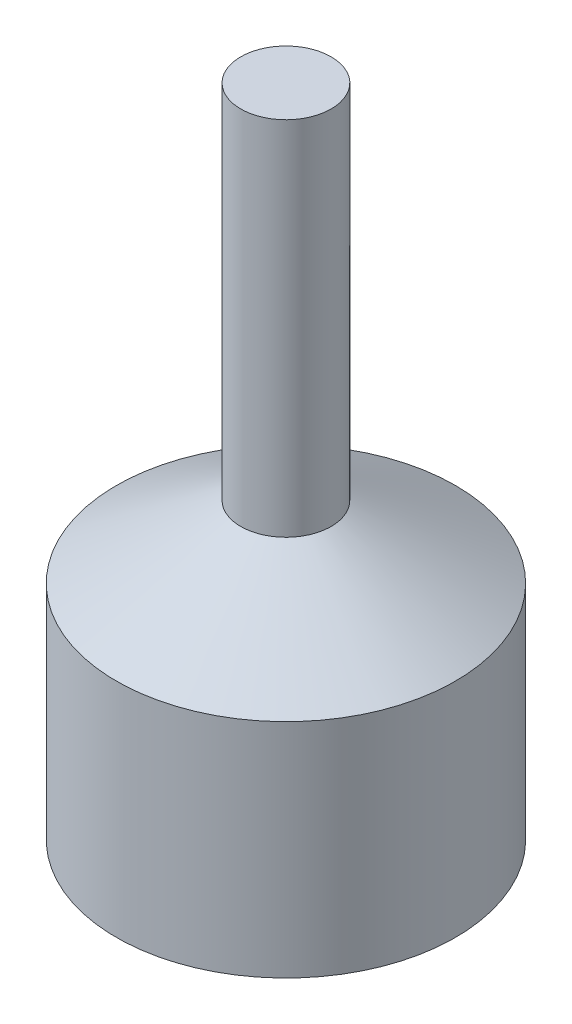
ISO-10303-21;
HEADER;
FILE_DESCRIPTION(('STEP AP214'),'2;1');
FILE_NAME('part.step','',(''),(''),'','','');
FILE_SCHEMA(('AUTOMOTIVE_DESIGN { 1 0 10303 214 1 1 1 1 }'));
ENDSEC;
DATA;
#1=APPLICATION_CONTEXT('core data for automotive mechanical design processes');
#2=APPLICATION_PROTOCOL_DEFINITION('international standard','automotive_design',2000,#1);
#3=PRODUCT_CONTEXT('',#1,'mechanical');
#4=PRODUCT('Part','Part','',(#3));
#5=PRODUCT_RELATED_PRODUCT_CATEGORY('part','',(#4));
#6=PRODUCT_DEFINITION_FORMATION('','',#4);
#7=PRODUCT_DEFINITION_CONTEXT('part definition',#1,'design');
#8=PRODUCT_DEFINITION('design','',#6,#7);
#9=PRODUCT_DEFINITION_SHAPE('','',#8);
#10=(LENGTH_UNIT() NAMED_UNIT(*) SI_UNIT(.MILLI.,.METRE.));
#11=(NAMED_UNIT(*) PLANE_ANGLE_UNIT() SI_UNIT($,.RADIAN.));
#12=(NAMED_UNIT(*) SI_UNIT($,.STERADIAN.) SOLID_ANGLE_UNIT());
#13=UNCERTAINTY_MEASURE_WITH_UNIT(LENGTH_MEASURE(1.E-05),#10,'distance_accuracy_value','');
#14=(GEOMETRIC_REPRESENTATION_CONTEXT(3) GLOBAL_UNCERTAINTY_ASSIGNED_CONTEXT((#13)) GLOBAL_UNIT_ASSIGNED_CONTEXT((#10,
#11,#12)) REPRESENTATION_CONTEXT('',''));
#15=CARTESIAN_POINT('',(0.,0.,0.));
#16=DIRECTION('',(0.,0.,1.));
#17=DIRECTION('',(1.,0.,0.));
#18=AXIS2_PLACEMENT_3D('',#15,#16,#17);
#19=CARTESIAN_POINT('',(0.,95.25,0.));
#20=DIRECTION('',(0.,1.,0.));
#21=DIRECTION('',(0.,0.,1.));
#22=AXIS2_PLACEMENT_3D('',#19,#20,#21);
#23=PLANE('',#22);
#24=CARTESIAN_POINT('',(0.,95.25,0.));
#25=DIRECTION('',(0.,-1.,0.));
#26=DIRECTION('',(0.,0.,-1.));
#27=AXIS2_PLACEMENT_3D('',#24,#25,#26);
#28=CIRCLE('',#27,6.35);
#29=CARTESIAN_POINT('',(0.,95.25,-6.35));
#30=VERTEX_POINT('',#29);
#31=EDGE_CURVE('E10',#30,#30,#28,.T.);
#32=ORIENTED_EDGE('',*,*,#31,.F.);
#33=EDGE_LOOP('',(#32));
#34=FACE_BOUND('',#33,.T.);
#35=ADVANCED_FACE('F36',(#34),#23,.T.);
#36=CARTESIAN_POINT('',(0.,0.,0.));
#37=DIRECTION('',(0.,-1.,0.));
#38=DIRECTION('',(0.,0.,-1.));
#39=AXIS2_PLACEMENT_3D('',#36,#37,#38);
#40=CYLINDRICAL_SURFACE('',#39,6.35);
#41=ORIENTED_EDGE('',*,*,#31,.T.);
#42=EDGE_LOOP('',(#41));
#43=FACE_BOUND('',#42,.T.);
#44=CARTESIAN_POINT('',(0.,44.45,0.));
#45=DIRECTION('',(0.,-1.,0.));
#46=DIRECTION('',(0.,0.,-1.));
#47=AXIS2_PLACEMENT_3D('',#44,#45,#46);
#48=CIRCLE('',#47,6.35000000000001);
#49=CARTESIAN_POINT('',(0.,44.45,-6.35));
#50=VERTEX_POINT('',#49);
#51=EDGE_CURVE('E42',#50,#50,#48,.T.);
#52=ORIENTED_EDGE('',*,*,#51,.F.);
#53=EDGE_LOOP('',(#52));
#54=FACE_BOUND('',#53,.T.);
#55=ADVANCED_FACE('F78',(#43,#54),#40,.T.);
#56=CARTESIAN_POINT('',(0.,34.3680209242762,0.));
#57=DIRECTION('',(0.,-1.,0.));
#58=DIRECTION('',(0.,0.,-1.));
#59=AXIS2_PLACEMENT_3D('',#56,#57,#58);
#60=CONICAL_SURFACE('',#59,23.8125,1.0471975511966);
#61=CARTESIAN_POINT('',(0.,34.3680209242762,0.));
#62=DIRECTION('',(0.,-1.,0.));
#63=DIRECTION('',(0.,0.,-1.));
#64=AXIS2_PLACEMENT_3D('',#61,#62,#63);
#65=CIRCLE('',#64,23.8125);
#66=CARTESIAN_POINT('',(0.,34.3680209242762,-23.8125));
#67=VERTEX_POINT('',#66);
#68=EDGE_CURVE('E46',#67,#67,#65,.T.);
#69=CARTESIAN_POINT('',(0.,44.45,-6.35));
#70=CARTESIAN_POINT('',(0.,44.3449793846279,-6.53190104166667));
#71=CARTESIAN_POINT('',(0.,44.2399587692558,-6.71380208333333));
#72=CARTESIAN_POINT('',(0.,44.0299175385115,-7.07760416666667));
#73=CARTESIAN_POINT('',(0.,43.9248969231394,-7.25950520833333));
#74=CARTESIAN_POINT('',(0.,43.7148556923951,-7.62330729166667));
#75=CARTESIAN_POINT('',(0.,43.609835077023,-7.80520833333333));
#76=CARTESIAN_POINT('',(0.,43.3997938462788,-8.16901041666667));
#77=CARTESIAN_POINT('',(0.,43.2947732309067,-8.35091145833334));
#78=CARTESIAN_POINT('',(0.,43.0847320001624,-8.71471354166667));
#79=CARTESIAN_POINT('',(0.,42.9797113847903,-8.89661458333333));
#80=CARTESIAN_POINT('',(0.,42.769670154046,-9.26041666666666));
#81=CARTESIAN_POINT('',(0.,42.6646495386739,-9.44231770833333));
#82=CARTESIAN_POINT('',(0.,42.4546083079297,-9.80611979166667));
#83=CARTESIAN_POINT('',(0.,42.3495876925576,-9.98802083333333));
#84=CARTESIAN_POINT('',(0.,42.1395464618133,-10.3518229166667));
#85=CARTESIAN_POINT('',(0.,42.0345258464412,-10.5337239583333));
#86=CARTESIAN_POINT('',(0.,41.8244846156969,-10.8975260416667));
#87=CARTESIAN_POINT('',(0.,41.7194640003248,-11.0794270833333));
#88=CARTESIAN_POINT('',(0.,41.5094227695806,-11.4432291666667));
#89=CARTESIAN_POINT('',(0.,41.4044021542084,-11.6251302083333));
#90=CARTESIAN_POINT('',(0.,41.1943609234642,-11.9889322916667));
#91=CARTESIAN_POINT('',(0.,41.0893403080921,-12.1708333333333));
#92=CARTESIAN_POINT('',(0.,40.8792990773478,-12.5346354166667));
#93=CARTESIAN_POINT('',(0.,40.7742784619757,-12.7165364583333));
#94=CARTESIAN_POINT('',(0.,40.5642372312315,-13.0803385416667));
#95=CARTESIAN_POINT('',(0.,40.4592166158593,-13.2622395833333));
#96=CARTESIAN_POINT('',(0.,40.2491753851151,-13.6260416666667));
#97=CARTESIAN_POINT('',(0.,40.144154769743,-13.8079427083333));
#98=CARTESIAN_POINT('',(0.,39.9341135389987,-14.1717447916667));
#99=CARTESIAN_POINT('',(0.,39.8290929236266,-14.3536458333333));
#100=CARTESIAN_POINT('',(0.,39.6190516928824,-14.7174479166667));
#101=CARTESIAN_POINT('',(0.,39.5140310775102,-14.8993489583333));
#102=CARTESIAN_POINT('',(0.,39.303989846766,-15.2631510416667));
#103=CARTESIAN_POINT('',(0.,39.1989692313939,-15.4450520833333));
#104=CARTESIAN_POINT('',(0.,38.9889280006496,-15.8088541666667));
#105=CARTESIAN_POINT('',(0.,38.8839073852775,-15.9907552083333));
#106=CARTESIAN_POINT('',(0.,38.6738661545333,-16.3545572916667));
#107=CARTESIAN_POINT('',(0.,38.5688455391611,-16.5364583333333));
#108=CARTESIAN_POINT('',(0.,38.3588043084169,-16.9002604166667));
#109=CARTESIAN_POINT('',(0.,38.2537836930448,-17.0821614583333));
#110=CARTESIAN_POINT('',(0.,38.0437424623005,-17.4459635416667));
#111=CARTESIAN_POINT('',(0.,37.9387218469284,-17.6278645833333));
#112=CARTESIAN_POINT('',(0.,37.7286806161842,-17.9916666666667));
#113=CARTESIAN_POINT('',(0.,37.623660000812,-18.1735677083333));
#114=CARTESIAN_POINT('',(0.,37.4136187700678,-18.5373697916667));
#115=CARTESIAN_POINT('',(0.,37.3085981546957,-18.7192708333333));
#116=CARTESIAN_POINT('',(0.,37.0985569239514,-19.0830729166667));
#117=CARTESIAN_POINT('',(0.,36.9935363085793,-19.2649739583333));
#118=CARTESIAN_POINT('',(0.,36.783495077835,-19.6287760416667));
#119=CARTESIAN_POINT('',(0.,36.6784744624629,-19.8106770833333));
#120=CARTESIAN_POINT('',(0.,36.4684332317187,-20.1744791666667));
#121=CARTESIAN_POINT('',(0.,36.3634126163466,-20.3563802083333));
#122=CARTESIAN_POINT('',(0.,36.1533713856023,-20.7201822916667));
#123=CARTESIAN_POINT('',(0.,36.0483507702302,-20.9020833333333));
#124=CARTESIAN_POINT('',(0.,35.8383095394859,-21.2658854166667));
#125=CARTESIAN_POINT('',(0.,35.7332889241138,-21.4477864583333));
#126=CARTESIAN_POINT('',(0.,35.5232476933696,-21.8115885416667));
#127=CARTESIAN_POINT('',(0.,35.4182270779975,-21.9934895833333));
#128=CARTESIAN_POINT('',(0.,35.2081858472532,-22.3572916666667));
#129=CARTESIAN_POINT('',(0.,35.1031652318811,-22.5391927083333));
#130=CARTESIAN_POINT('',(0.,34.8931240011368,-22.9029947916667));
#131=CARTESIAN_POINT('',(0.,34.7881033857647,-23.0848958333333));
#132=CARTESIAN_POINT('',(0.,34.5780621550205,-23.4486979166667));
#133=CARTESIAN_POINT('',(0.,34.4730415396484,-23.6305989583333));
#134=CARTESIAN_POINT('',(0.,34.3680209242762,-23.8125));
#135=B_SPLINE_CURVE_WITH_KNOTS('',3,(#69,#70,#71,#72,#73,#74,#75,#76,#77,#78,#79,#80,#81,#82,
#83,#84,#85,#86,#87,#88,#89,#90,#91,#92,#93,#94,#95,#96,#97,#98,#99,#100,#101,#102,#103,#104,
#105,#106,#107,#108,#109,#110,#111,#112,#113,#114,#115,#116,#117,#118,#119,#120,#121,#122,#123,
#124,#125,#126,#127,#128,#129,#130,#131,#132,#133,#134),.UNSPECIFIED.,.F.,.F.,(4,2,2,2,2,2,2,2,
2,2,2,2,2,2,2,2,2,2,2,2,2,2,2,2,2,2,2,2,2,2,2,2,4),(0.,0.630123692232735,1.26024738446548,
1.89037107669822,2.52049476893095,3.15061846116369,3.78074215339643,4.41086584562917,
5.04098953786191,5.67111323009465,6.30123692232739,6.93136061456012,7.56148430679286,
8.1916079990256,8.82173169125834,9.45185538349108,10.0819790757238,10.7121027679566,
11.3422264601893,11.972350152422,12.6024738446548,13.2325975368875,13.8627212291202,
14.492844921353,15.1229686135857,15.7530923058185,16.3832159980512,17.0133396902839,
17.6434633825167,18.2735870747494,18.9037107669822,19.5338344592149,20.1639581514476),.UNSPECIFIED.);
#136=EDGE_CURVE('BSEAM83',#50,#67,#135,.T.);
#137=ORIENTED_EDGE('',*,*,#51,.T.);
#138=ORIENTED_EDGE('',*,*,#68,.F.);
#139=ORIENTED_EDGE('',*,*,#136,.T.);
#140=ORIENTED_EDGE('',*,*,#136,.F.);
#141=EDGE_LOOP('',(#137,#139,#138,#140));
#142=FACE_BOUND('',#141,.T.);
#143=ADVANCED_FACE('F83',(#142),#60,.T.);
#144=CARTESIAN_POINT('',(0.,0.,0.));
#145=DIRECTION('',(0.,-1.,0.));
#146=DIRECTION('',(0.,0.,-1.));
#147=AXIS2_PLACEMENT_3D('',#144,#145,#146);
#148=CYLINDRICAL_SURFACE('',#147,23.8125);
#149=ORIENTED_EDGE('',*,*,#68,.T.);
#150=EDGE_LOOP('',(#149));
#151=FACE_BOUND('',#150,.T.);
#152=CARTESIAN_POINT('',(0.,3.175,0.));
#153=DIRECTION('',(0.,-1.,0.));
#154=DIRECTION('',(0.,0.,-1.));
#155=AXIS2_PLACEMENT_3D('',#152,#153,#154);
#156=CIRCLE('',#155,23.8125);
#157=CARTESIAN_POINT('',(0.,3.175,-23.8125));
#158=VERTEX_POINT('',#157);
#159=EDGE_CURVE('E50',#158,#158,#156,.T.);
#160=ORIENTED_EDGE('',*,*,#159,.F.);
#161=EDGE_LOOP('',(#160));
#162=FACE_BOUND('',#161,.T.);
#163=ADVANCED_FACE('F74',(#151,#162),#148,.T.);
#164=CARTESIAN_POINT('',(0.,3.175,-23.8125));
#165=DIRECTION('',(0.,-1.,0.));
#166=DIRECTION('',(0.,0.,-1.));
#167=AXIS2_PLACEMENT_3D('',#164,#165,#166);
#168=PLANE('',#167);
#169=ORIENTED_EDGE('',*,*,#159,.T.);
#170=EDGE_LOOP('',(#169));
#171=FACE_BOUND('',#170,.T.);
#172=CARTESIAN_POINT('',(0.,3.175,0.));
#173=DIRECTION('',(0.,-1.,0.));
#174=DIRECTION('',(0.,0.,-1.));
#175=AXIS2_PLACEMENT_3D('',#172,#173,#174);
#176=CIRCLE('',#175,19.05);
#177=CARTESIAN_POINT('',(0.,3.175,-19.05));
#178=VERTEX_POINT('',#177);
#179=EDGE_CURVE('E55',#178,#178,#176,.T.);
#180=ORIENTED_EDGE('',*,*,#179,.F.);
#181=EDGE_LOOP('',(#180));
#182=FACE_BOUND('',#181,.T.);
#183=ADVANCED_FACE('F66',(#171,#182),#168,.T.);
#184=CARTESIAN_POINT('',(0.,0.,0.));
#185=DIRECTION('',(0.,-1.,0.));
#186=DIRECTION('',(0.,0.,-1.));
#187=AXIS2_PLACEMENT_3D('',#184,#185,#186);
#188=CYLINDRICAL_SURFACE('',#187,19.05);
#189=ORIENTED_EDGE('',*,*,#179,.T.);
#190=EDGE_LOOP('',(#189));
#191=FACE_BOUND('',#190,.T.);
#192=CARTESIAN_POINT('',(0.,0.,0.));
#193=DIRECTION('',(0.,-1.,0.));
#194=DIRECTION('',(0.,0.,-1.));
#195=AXIS2_PLACEMENT_3D('',#192,#193,#194);
#196=CIRCLE('',#195,19.05);
#197=CARTESIAN_POINT('',(0.,0.,-19.05));
#198=VERTEX_POINT('',#197);
#199=EDGE_CURVE('E58',#198,#198,#196,.T.);
#200=ORIENTED_EDGE('',*,*,#199,.F.);
#201=EDGE_LOOP('',(#200));
#202=FACE_BOUND('',#201,.T.);
#203=ADVANCED_FACE('F64',(#191,#202),#188,.T.);
#204=CARTESIAN_POINT('',(0.,0.,-19.05));
#205=DIRECTION('',(0.,-1.,0.));
#206=DIRECTION('',(0.,0.,-1.));
#207=AXIS2_PLACEMENT_3D('',#204,#205,#206);
#208=PLANE('',#207);
#209=ORIENTED_EDGE('',*,*,#199,.T.);
#210=EDGE_LOOP('',(#209));
#211=FACE_BOUND('',#210,.T.);
#212=ADVANCED_FACE('F62',(#211),#208,.T.);
#213=CLOSED_SHELL('',(#35,#55,#143,#163,#183,#203,#212));
#214=MANIFOLD_SOLID_BREP('B2',#213);
#215=ADVANCED_BREP_SHAPE_REPRESENTATION('',(#18,#214),#14);
#216=SHAPE_DEFINITION_REPRESENTATION(#9,#215);
ENDSEC;
END-ISO-10303-21;
